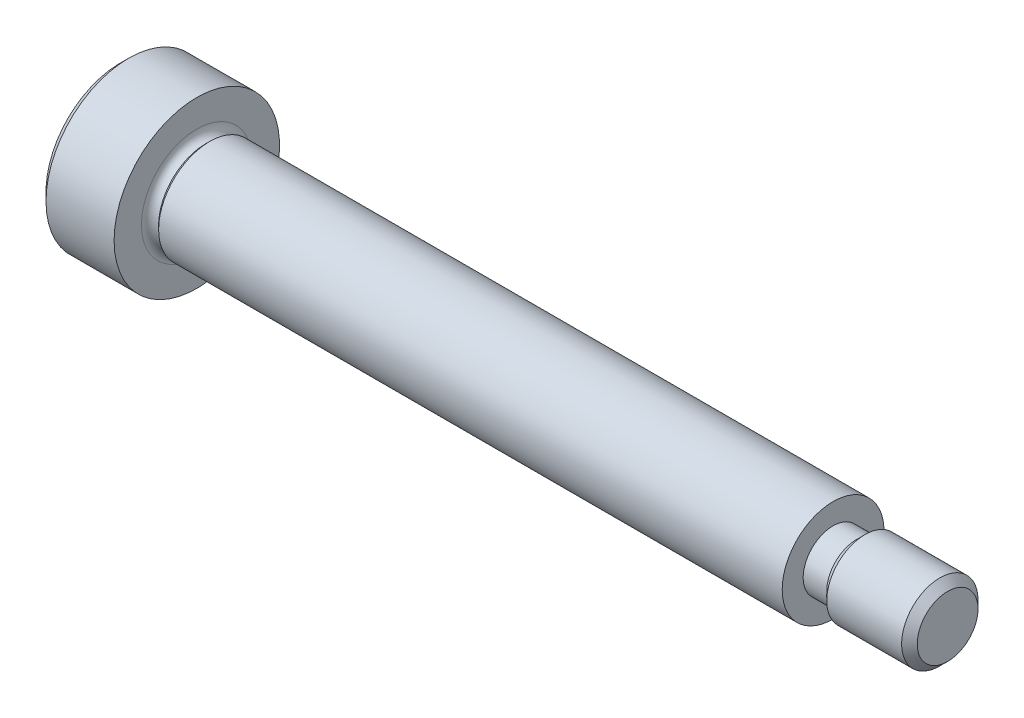
ISO-10303-21;
HEADER;
FILE_DESCRIPTION(('STEP AP214'),'2;1');
FILE_NAME('part.step','',(''),(''),'','','');
FILE_SCHEMA(('AUTOMOTIVE_DESIGN { 1 0 10303 214 1 1 1 1 }'));
ENDSEC;
DATA;
#1=APPLICATION_CONTEXT('core data for automotive mechanical design processes');
#2=APPLICATION_PROTOCOL_DEFINITION('international standard','automotive_design',2000,#1);
#3=PRODUCT_CONTEXT('',#1,'mechanical');
#4=PRODUCT('Part','Part','',(#3));
#5=PRODUCT_RELATED_PRODUCT_CATEGORY('part','',(#4));
#6=PRODUCT_DEFINITION_FORMATION('','',#4);
#7=PRODUCT_DEFINITION_CONTEXT('part definition',#1,'design');
#8=PRODUCT_DEFINITION('design','',#6,#7);
#9=PRODUCT_DEFINITION_SHAPE('','',#8);
#10=(LENGTH_UNIT() NAMED_UNIT(*) SI_UNIT(.MILLI.,.METRE.));
#11=(NAMED_UNIT(*) PLANE_ANGLE_UNIT() SI_UNIT($,.RADIAN.));
#12=(NAMED_UNIT(*) SI_UNIT($,.STERADIAN.) SOLID_ANGLE_UNIT());
#13=UNCERTAINTY_MEASURE_WITH_UNIT(LENGTH_MEASURE(1.E-05),#10,'distance_accuracy_value','');
#14=(GEOMETRIC_REPRESENTATION_CONTEXT(3) GLOBAL_UNCERTAINTY_ASSIGNED_CONTEXT((#13)) GLOBAL_UNIT_ASSIGNED_CONTEXT((#10,
#11,#12)) REPRESENTATION_CONTEXT('',''));
#15=CARTESIAN_POINT('',(0.,0.,0.));
#16=DIRECTION('',(0.,0.,1.));
#17=DIRECTION('',(1.,0.,0.));
#18=AXIS2_PLACEMENT_3D('',#15,#16,#17);
#19=CARTESIAN_POINT('',(-6.,-6.00984515230403,5.85));
#20=DIRECTION('',(-1.,0.,0.));
#21=DIRECTION('',(0.,1.,0.));
#22=AXIS2_PLACEMENT_3D('',#19,#20,#21);
#23=PLANE('',#22);
#24=CARTESIAN_POINT('',(-6.,0.,0.));
#25=DIRECTION('',(-1.,0.,0.));
#26=DIRECTION('',(0.,0.,-1.));
#27=AXIS2_PLACEMENT_3D('',#24,#25,#26);
#28=CIRCLE('',#27,5.85);
#29=CARTESIAN_POINT('',(-6.,0.,-5.85));
#30=VERTEX_POINT('',#29);
#31=EDGE_CURVE('E111',#30,#30,#28,.F.);
#32=ORIENTED_EDGE('',*,*,#31,.F.);
#33=EDGE_LOOP('',(#32));
#34=FACE_BOUND('',#33,.T.);
#35=DIRECTION('',(0.,0.499999999999983,-0.866025403784448));
#36=VECTOR('',#35,1.);
#37=CARTESIAN_POINT('',(-6.,-2.8867513459481,0.));
#38=LINE('',#37,#36);
#39=CARTESIAN_POINT('',(-6.,-1.4433756729741,-2.5));
#40=VERTEX_POINT('',#39);
#41=CARTESIAN_POINT('',(-6.,-2.8867513459481,0.));
#42=VERTEX_POINT('',#41);
#43=EDGE_CURVE('E98',#40,#42,#38,.F.);
#44=ORIENTED_EDGE('',*,*,#43,.F.);
#45=DIRECTION('',(0.,1.,0.));
#46=VECTOR('',#45,1.);
#47=CARTESIAN_POINT('',(-6.,-1.4433756729741,-2.5));
#48=LINE('',#47,#46);
#49=CARTESIAN_POINT('',(-6.,1.4433756729741,-2.5));
#50=VERTEX_POINT('',#49);
#51=EDGE_CURVE('E87',#50,#40,#48,.F.);
#52=ORIENTED_EDGE('',*,*,#51,.F.);
#53=DIRECTION('',(0.,0.499999999999983,0.866025403784449));
#54=VECTOR('',#53,1.);
#55=CARTESIAN_POINT('',(-6.,1.4433756729741,-2.5));
#56=LINE('',#55,#54);
#57=CARTESIAN_POINT('',(-6.,2.8867513459481,0.));
#58=VERTEX_POINT('',#57);
#59=EDGE_CURVE('E97',#58,#50,#56,.F.);
#60=ORIENTED_EDGE('',*,*,#59,.F.);
#61=DIRECTION('',(0.,-0.499999999999982,0.866025403784449));
#62=VECTOR('',#61,1.);
#63=CARTESIAN_POINT('',(-6.,2.8867513459481,0.));
#64=LINE('',#63,#62);
#65=CARTESIAN_POINT('',(-6.,1.4433756729741,2.5));
#66=VERTEX_POINT('',#65);
#67=EDGE_CURVE('E121',#66,#58,#64,.F.);
#68=ORIENTED_EDGE('',*,*,#67,.F.);
#69=DIRECTION('',(0.,-1.,0.));
#70=VECTOR('',#69,1.);
#71=CARTESIAN_POINT('',(-6.,1.4433756729741,2.5));
#72=LINE('',#71,#70);
#73=CARTESIAN_POINT('',(-6.,-1.4433756729741,2.5));
#74=VERTEX_POINT('',#73);
#75=EDGE_CURVE('E125',#74,#66,#72,.F.);
#76=ORIENTED_EDGE('',*,*,#75,.F.);
#77=DIRECTION('',(0.,-0.499999999999983,-0.866025403784448));
#78=VECTOR('',#77,1.);
#79=CARTESIAN_POINT('',(-6.,-1.4433756729741,2.5));
#80=LINE('',#79,#78);
#81=EDGE_CURVE('E110',#42,#74,#80,.F.);
#82=ORIENTED_EDGE('',*,*,#81,.F.);
#83=EDGE_LOOP('',(#44,#52,#60,#68,#76,#82));
#84=FACE_BOUND('',#83,.T.);
#85=ADVANCED_FACE('F17',(#34,#84),#23,.T.);
#86=CARTESIAN_POINT('',(0.,-6.67760572478225,-6.5));
#87=DIRECTION('',(1.,0.,0.));
#88=DIRECTION('',(0.,1.,0.));
#89=AXIS2_PLACEMENT_3D('',#86,#87,#88);
#90=PLANE('',#89);
#91=CARTESIAN_POINT('',(0.,0.,0.));
#92=DIRECTION('',(1.,0.,0.));
#93=DIRECTION('',(0.,0.,1.));
#94=AXIS2_PLACEMENT_3D('',#91,#92,#93);
#95=CIRCLE('',#94,6.5);
#96=CARTESIAN_POINT('',(0.,0.,6.5));
#97=VERTEX_POINT('',#96);
#98=EDGE_CURVE('E133',#97,#97,#95,.T.);
#99=ORIENTED_EDGE('',*,*,#98,.T.);
#100=EDGE_LOOP('',(#99));
#101=FACE_BOUND('',#100,.T.);
#102=CARTESIAN_POINT('',(0.,0.,0.));
#103=DIRECTION('',(-1.,0.,0.));
#104=DIRECTION('',(0.,0.,-1.));
#105=AXIS2_PLACEMENT_3D('',#102,#103,#104);
#106=CIRCLE('',#105,4.35000000000001);
#107=CARTESIAN_POINT('',(0.,0.,-4.35000000000001));
#108=VERTEX_POINT('',#107);
#109=EDGE_CURVE('E138',#108,#108,#106,.F.);
#110=ORIENTED_EDGE('',*,*,#109,.F.);
#111=EDGE_LOOP('',(#110));
#112=FACE_BOUND('',#111,.T.);
#113=ADVANCED_FACE('F284',(#101,#112),#90,.T.);
#114=CARTESIAN_POINT('',(50.,-4.,-4.));
#115=DIRECTION('',(1.,0.,0.));
#116=DIRECTION('',(0.,1.,0.));
#117=AXIS2_PLACEMENT_3D('',#114,#115,#116);
#118=PLANE('',#117);
#119=CARTESIAN_POINT('',(50.,0.,0.));
#120=DIRECTION('',(1.,0.,0.));
#121=DIRECTION('',(0.,0.,1.));
#122=AXIS2_PLACEMENT_3D('',#119,#120,#121);
#123=CIRCLE('',#122,4.);
#124=CARTESIAN_POINT('',(50.,0.,4.));
#125=VERTEX_POINT('',#124);
#126=EDGE_CURVE('E141',#125,#125,#123,.T.);
#127=ORIENTED_EDGE('',*,*,#126,.T.);
#128=EDGE_LOOP('',(#127));
#129=FACE_BOUND('',#128,.T.);
#130=CARTESIAN_POINT('',(50.,0.,0.));
#131=DIRECTION('',(-1.,0.,0.));
#132=DIRECTION('',(0.,0.,-1.));
#133=AXIS2_PLACEMENT_3D('',#130,#131,#132);
#134=CIRCLE('',#133,2.35);
#135=CARTESIAN_POINT('',(50.,0.,-2.35));
#136=VERTEX_POINT('',#135);
#137=EDGE_CURVE('E144',#136,#136,#134,.F.);
#138=ORIENTED_EDGE('',*,*,#137,.F.);
#139=EDGE_LOOP('',(#138));
#140=FACE_BOUND('',#139,.T.);
#141=ADVANCED_FACE('F281',(#129,#140),#118,.T.);
#142=CARTESIAN_POINT('',(59.,-2.3865,-2.3865));
#143=DIRECTION('',(1.,0.,0.));
#144=DIRECTION('',(0.,1.,0.));
#145=AXIS2_PLACEMENT_3D('',#142,#143,#144);
#146=PLANE('',#145);
#147=CARTESIAN_POINT('',(59.,0.,0.));
#148=DIRECTION('',(1.,0.,0.));
#149=DIRECTION('',(0.,0.,1.));
#150=AXIS2_PLACEMENT_3D('',#147,#148,#149);
#151=CIRCLE('',#150,2.3865);
#152=CARTESIAN_POINT('',(59.,0.,2.3865));
#153=VERTEX_POINT('',#152);
#154=EDGE_CURVE('E147',#153,#153,#151,.T.);
#155=ORIENTED_EDGE('',*,*,#154,.T.);
#156=EDGE_LOOP('',(#155));
#157=FACE_BOUND('',#156,.T.);
#158=ADVANCED_FACE('F283',(#157),#146,.T.);
#159=CARTESIAN_POINT('',(-3.,-2.16506350946112,-1.24999999999996));
#160=DIRECTION('',(-1.,0.,0.));
#161=DIRECTION('',(0.,1.,0.));
#162=AXIS2_PLACEMENT_3D('',#159,#160,#161);
#163=PLANE('',#162);
#164=DIRECTION('',(0.,-1.,0.));
#165=VECTOR('',#164,1.);
#166=CARTESIAN_POINT('',(-3.,0.,-2.5));
#167=LINE('',#166,#165);
#168=CARTESIAN_POINT('',(-3.,-1.4433756729741,-2.5));
#169=VERTEX_POINT('',#168);
#170=CARTESIAN_POINT('',(-3.,0.,-2.5));
#171=VERTEX_POINT('',#170);
#172=EDGE_CURVE('E150',#169,#171,#167,.F.);
#173=ORIENTED_EDGE('',*,*,#172,.F.);
#174=DIRECTION('',(0.,-0.499999999999983,0.866025403784448));
#175=VECTOR('',#174,1.);
#176=CARTESIAN_POINT('',(-3.,-1.4433756729741,-2.5));
#177=LINE('',#176,#175);
#178=CARTESIAN_POINT('',(-3.,-2.16506350946112,-1.24999999999996));
#179=VERTEX_POINT('',#178);
#180=EDGE_CURVE('E105',#179,#169,#177,.F.);
#181=ORIENTED_EDGE('',*,*,#180,.F.);
#182=CARTESIAN_POINT('',(-3.,0.,0.));
#183=DIRECTION('',(1.,0.,0.));
#184=DIRECTION('',(0.,-0.866025403784448,-0.499999999999983));
#185=AXIS2_PLACEMENT_3D('',#182,#183,#184);
#186=CIRCLE('',#185,2.5);
#187=EDGE_CURVE('E155',#179,#171,#186,.T.);
#188=ORIENTED_EDGE('',*,*,#187,.T.);
#189=EDGE_LOOP('',(#173,#181,#188));
#190=FACE_BOUND('',#189,.T.);
#191=ADVANCED_FACE('F292',(#190),#163,.T.);
#192=CARTESIAN_POINT('',(-3.,-2.8867513459481,1.24999999999996));
#193=DIRECTION('',(-1.,0.,0.));
#194=DIRECTION('',(0.,1.,0.));
#195=AXIS2_PLACEMENT_3D('',#192,#193,#194);
#196=PLANE('',#195);
#197=DIRECTION('',(0.,-0.499999999999983,0.866025403784448));
#198=VECTOR('',#197,1.);
#199=CARTESIAN_POINT('',(-3.,-2.16506350946112,-1.24999999999996));
#200=LINE('',#199,#198);
#201=CARTESIAN_POINT('',(-3.,-2.8867513459481,0.));
#202=VERTEX_POINT('',#201);
#203=EDGE_CURVE('E160',#202,#179,#200,.F.);
#204=ORIENTED_EDGE('',*,*,#203,.F.);
#205=DIRECTION('',(0.,0.499999999999983,0.866025403784448));
#206=VECTOR('',#205,1.);
#207=CARTESIAN_POINT('',(-3.,-2.8867513459481,0.));
#208=LINE('',#207,#206);
#209=CARTESIAN_POINT('',(-3.,-2.16506350946112,1.24999999999996));
#210=VERTEX_POINT('',#209);
#211=EDGE_CURVE('E164',#210,#202,#208,.F.);
#212=ORIENTED_EDGE('',*,*,#211,.F.);
#213=CARTESIAN_POINT('',(-3.,0.,0.));
#214=DIRECTION('',(1.,0.,0.));
#215=DIRECTION('',(0.,-0.866025403784448,0.499999999999983));
#216=AXIS2_PLACEMENT_3D('',#213,#214,#215);
#217=CIRCLE('',#216,2.5);
#218=EDGE_CURVE('E169',#210,#179,#217,.T.);
#219=ORIENTED_EDGE('',*,*,#218,.T.);
#220=EDGE_LOOP('',(#204,#212,#219));
#221=FACE_BOUND('',#220,.T.);
#222=ADVANCED_FACE('F355',(#221),#196,.T.);
#223=CARTESIAN_POINT('',(-3.,-2.16506350946112,2.5));
#224=DIRECTION('',(-1.,0.,0.));
#225=DIRECTION('',(0.,1.,0.));
#226=AXIS2_PLACEMENT_3D('',#223,#224,#225);
#227=PLANE('',#226);
#228=DIRECTION('',(0.,0.499999999999983,0.866025403784448));
#229=VECTOR('',#228,1.);
#230=CARTESIAN_POINT('',(-3.,-2.16506350946112,1.24999999999996));
#231=LINE('',#230,#229);
#232=CARTESIAN_POINT('',(-3.,-1.4433756729741,2.5));
#233=VERTEX_POINT('',#232);
#234=EDGE_CURVE('E174',#233,#210,#231,.F.);
#235=ORIENTED_EDGE('',*,*,#234,.F.);
#236=DIRECTION('',(0.,1.,0.));
#237=VECTOR('',#236,1.);
#238=CARTESIAN_POINT('',(-3.,-1.4433756729741,2.5));
#239=LINE('',#238,#237);
#240=CARTESIAN_POINT('',(-3.,0.,2.5));
#241=VERTEX_POINT('',#240);
#242=EDGE_CURVE('E178',#241,#233,#239,.F.);
#243=ORIENTED_EDGE('',*,*,#242,.F.);
#244=CARTESIAN_POINT('',(-3.,0.,0.));
#245=DIRECTION('',(1.,0.,0.));
#246=DIRECTION('',(0.,0.,1.));
#247=AXIS2_PLACEMENT_3D('',#244,#245,#246);
#248=CIRCLE('',#247,2.5);
#249=EDGE_CURVE('E183',#241,#210,#248,.T.);
#250=ORIENTED_EDGE('',*,*,#249,.T.);
#251=EDGE_LOOP('',(#235,#243,#250));
#252=FACE_BOUND('',#251,.T.);
#253=ADVANCED_FACE('F361',(#252),#227,.T.);
#254=CARTESIAN_POINT('',(-3.,0.,2.5));
#255=DIRECTION('',(-1.,0.,0.));
#256=DIRECTION('',(0.,1.,0.));
#257=AXIS2_PLACEMENT_3D('',#254,#255,#256);
#258=PLANE('',#257);
#259=DIRECTION('',(0.,1.,0.));
#260=VECTOR('',#259,1.);
#261=CARTESIAN_POINT('',(-3.,0.,2.5));
#262=LINE('',#261,#260);
#263=CARTESIAN_POINT('',(-3.,1.4433756729741,2.5));
#264=VERTEX_POINT('',#263);
#265=EDGE_CURVE('E188',#264,#241,#262,.F.);
#266=ORIENTED_EDGE('',*,*,#265,.F.);
#267=DIRECTION('',(0.,0.499999999999982,-0.866025403784449));
#268=VECTOR('',#267,1.);
#269=CARTESIAN_POINT('',(-3.,1.4433756729741,2.5));
#270=LINE('',#269,#268);
#271=CARTESIAN_POINT('',(-3.,2.16506350946112,1.24999999999996));
#272=VERTEX_POINT('',#271);
#273=EDGE_CURVE('E192',#272,#264,#270,.F.);
#274=ORIENTED_EDGE('',*,*,#273,.F.);
#275=CARTESIAN_POINT('',(-3.,0.,0.));
#276=DIRECTION('',(1.,0.,0.));
#277=DIRECTION('',(0.,0.866025403784448,0.499999999999983));
#278=AXIS2_PLACEMENT_3D('',#275,#276,#277);
#279=CIRCLE('',#278,2.5);
#280=EDGE_CURVE('E196',#272,#241,#279,.T.);
#281=ORIENTED_EDGE('',*,*,#280,.T.);
#282=EDGE_LOOP('',(#266,#274,#281));
#283=FACE_BOUND('',#282,.T.);
#284=ADVANCED_FACE('F368',(#283),#258,.T.);
#285=CARTESIAN_POINT('',(-3.,2.16506350946112,1.24999999999996));
#286=DIRECTION('',(-1.,0.,0.));
#287=DIRECTION('',(0.,1.,0.));
#288=AXIS2_PLACEMENT_3D('',#285,#286,#287);
#289=PLANE('',#288);
#290=DIRECTION('',(0.,0.499999999999985,-0.866025403784448));
#291=VECTOR('',#290,1.);
#292=CARTESIAN_POINT('',(-3.,2.16506350946112,1.24999999999996));
#293=LINE('',#292,#291);
#294=CARTESIAN_POINT('',(-3.,2.8867513459481,0.));
#295=VERTEX_POINT('',#294);
#296=EDGE_CURVE('E201',#295,#272,#293,.F.);
#297=ORIENTED_EDGE('',*,*,#296,.F.);
#298=DIRECTION('',(0.,-0.499999999999984,-0.866025403784448));
#299=VECTOR('',#298,1.);
#300=CARTESIAN_POINT('',(-3.,2.8867513459481,0.));
#301=LINE('',#300,#299);
#302=CARTESIAN_POINT('',(-3.,2.16506350946112,-1.24999999999996));
#303=VERTEX_POINT('',#302);
#304=EDGE_CURVE('E205',#303,#295,#301,.F.);
#305=ORIENTED_EDGE('',*,*,#304,.F.);
#306=CARTESIAN_POINT('',(-3.,0.,0.));
#307=DIRECTION('',(1.,0.,0.));
#308=DIRECTION('',(0.,0.866025403784448,-0.499999999999983));
#309=AXIS2_PLACEMENT_3D('',#306,#307,#308);
#310=CIRCLE('',#309,2.5);
#311=EDGE_CURVE('E210',#303,#272,#310,.T.);
#312=ORIENTED_EDGE('',*,*,#311,.T.);
#313=EDGE_LOOP('',(#297,#305,#312));
#314=FACE_BOUND('',#313,.T.);
#315=ADVANCED_FACE('F373',(#314),#289,.T.);
#316=CARTESIAN_POINT('',(-3.,0.,-1.24999999999996));
#317=DIRECTION('',(-1.,0.,0.));
#318=DIRECTION('',(0.,1.,0.));
#319=AXIS2_PLACEMENT_3D('',#316,#317,#318);
#320=PLANE('',#319);
#321=DIRECTION('',(0.,-0.499999999999983,-0.866025403784449));
#322=VECTOR('',#321,1.);
#323=CARTESIAN_POINT('',(-3.,2.16506350946112,-1.24999999999996));
#324=LINE('',#323,#322);
#325=CARTESIAN_POINT('',(-3.,1.4433756729741,-2.5));
#326=VERTEX_POINT('',#325);
#327=EDGE_CURVE('E215',#326,#303,#324,.F.);
#328=ORIENTED_EDGE('',*,*,#327,.F.);
#329=DIRECTION('',(0.,-1.,0.));
#330=VECTOR('',#329,1.);
#331=CARTESIAN_POINT('',(-3.,1.4433756729741,-2.5));
#332=LINE('',#331,#330);
#333=EDGE_CURVE('E219',#171,#326,#332,.F.);
#334=ORIENTED_EDGE('',*,*,#333,.F.);
#335=CARTESIAN_POINT('',(-3.,0.,0.));
#336=DIRECTION('',(1.,0.,0.));
#337=DIRECTION('',(0.,0.,-1.));
#338=AXIS2_PLACEMENT_3D('',#335,#336,#337);
#339=CIRCLE('',#338,2.5);
#340=EDGE_CURVE('E223',#171,#303,#339,.T.);
#341=ORIENTED_EDGE('',*,*,#340,.T.);
#342=EDGE_LOOP('',(#328,#334,#341));
#343=FACE_BOUND('',#342,.T.);
#344=ADVANCED_FACE('F376',(#343),#320,.T.);
#345=CARTESIAN_POINT('',(-3.,-1.4433756729741,2.5));
#346=DIRECTION('',(0.,0.,-1.));
#347=DIRECTION('',(-1.,0.,0.));
#348=AXIS2_PLACEMENT_3D('',#345,#346,#347);
#349=PLANE('',#348);
#350=ORIENTED_EDGE('',*,*,#265,.T.);
#351=ORIENTED_EDGE('',*,*,#242,.T.);
#352=DIRECTION('',(-1.,0.,0.));
#353=VECTOR('',#352,1.);
#354=CARTESIAN_POINT('',(-3.,-1.4433756729741,2.5));
#355=LINE('',#354,#353);
#356=EDGE_CURVE('E228',#233,#74,#355,.T.);
#357=ORIENTED_EDGE('',*,*,#356,.T.);
#358=ORIENTED_EDGE('',*,*,#75,.T.);
#359=DIRECTION('',(1.,0.,0.));
#360=VECTOR('',#359,1.);
#361=CARTESIAN_POINT('',(-6.,1.4433756729741,2.5));
#362=LINE('',#361,#360);
#363=EDGE_CURVE('E233',#264,#66,#362,.F.);
#364=ORIENTED_EDGE('',*,*,#363,.F.);
#365=EDGE_LOOP('',(#350,#351,#357,#358,#364));
#366=FACE_BOUND('',#365,.T.);
#367=ADVANCED_FACE('F363',(#366),#349,.T.);
#368=CARTESIAN_POINT('',(-6.,-2.8867513459481,0.));
#369=DIRECTION('',(0.,0.866025403784449,-0.499999999999983));
#370=DIRECTION('',(0.,0.499999999999983,0.866025403784449));
#371=AXIS2_PLACEMENT_3D('',#368,#369,#370);
#372=PLANE('',#371);
#373=ORIENTED_EDGE('',*,*,#234,.T.);
#374=ORIENTED_EDGE('',*,*,#211,.T.);
#375=DIRECTION('',(-1.,0.,0.));
#376=VECTOR('',#375,1.);
#377=CARTESIAN_POINT('',(-3.,-2.8867513459481,0.));
#378=LINE('',#377,#376);
#379=EDGE_CURVE('E106',#202,#42,#378,.T.);
#380=ORIENTED_EDGE('',*,*,#379,.T.);
#381=ORIENTED_EDGE('',*,*,#81,.T.);
#382=ORIENTED_EDGE('',*,*,#356,.F.);
#383=EDGE_LOOP('',(#373,#374,#380,#381,#382));
#384=FACE_BOUND('',#383,.T.);
#385=ADVANCED_FACE('F357',(#384),#372,.T.);
#386=CARTESIAN_POINT('',(-6.,-1.4433756729741,-2.5));
#387=DIRECTION('',(0.,0.866025403784449,0.499999999999983));
#388=DIRECTION('',(0.,-0.499999999999983,0.866025403784449));
#389=AXIS2_PLACEMENT_3D('',#386,#387,#388);
#390=PLANE('',#389);
#391=ORIENTED_EDGE('',*,*,#203,.T.);
#392=ORIENTED_EDGE('',*,*,#180,.T.);
#393=DIRECTION('',(-1.,0.,0.));
#394=VECTOR('',#393,1.);
#395=CARTESIAN_POINT('',(-3.,-1.4433756729741,-2.5));
#396=LINE('',#395,#394);
#397=EDGE_CURVE('E91',#169,#40,#396,.T.);
#398=ORIENTED_EDGE('',*,*,#397,.T.);
#399=ORIENTED_EDGE('',*,*,#43,.T.);
#400=ORIENTED_EDGE('',*,*,#379,.F.);
#401=EDGE_LOOP('',(#391,#392,#398,#399,#400));
#402=FACE_BOUND('',#401,.T.);
#403=ADVANCED_FACE('F102',(#402),#390,.T.);
#404=CARTESIAN_POINT('',(-6.,-1.4433756729741,-2.5));
#405=DIRECTION('',(0.,0.,1.));
#406=DIRECTION('',(1.,0.,0.));
#407=AXIS2_PLACEMENT_3D('',#404,#405,#406);
#408=PLANE('',#407);
#409=ORIENTED_EDGE('',*,*,#172,.T.);
#410=ORIENTED_EDGE('',*,*,#333,.T.);
#411=DIRECTION('',(-1.,0.,0.));
#412=VECTOR('',#411,1.);
#413=CARTESIAN_POINT('',(-3.,1.4433756729741,-2.5));
#414=LINE('',#413,#412);
#415=EDGE_CURVE('E35',#326,#50,#414,.T.);
#416=ORIENTED_EDGE('',*,*,#415,.T.);
#417=ORIENTED_EDGE('',*,*,#51,.T.);
#418=ORIENTED_EDGE('',*,*,#397,.F.);
#419=EDGE_LOOP('',(#409,#410,#416,#417,#418));
#420=FACE_BOUND('',#419,.T.);
#421=ADVANCED_FACE('F90',(#420),#408,.T.);
#422=CARTESIAN_POINT('',(-6.,2.8867513459481,0.));
#423=DIRECTION('',(0.,-0.866025403784449,0.499999999999983));
#424=DIRECTION('',(0.,-0.499999999999983,-0.866025403784449));
#425=AXIS2_PLACEMENT_3D('',#422,#423,#424);
#426=PLANE('',#425);
#427=ORIENTED_EDGE('',*,*,#327,.T.);
#428=ORIENTED_EDGE('',*,*,#304,.T.);
#429=DIRECTION('',(-1.,0.,0.));
#430=VECTOR('',#429,1.);
#431=CARTESIAN_POINT('',(-3.,2.8867513459481,0.));
#432=LINE('',#431,#430);
#433=EDGE_CURVE('E245',#295,#58,#432,.T.);
#434=ORIENTED_EDGE('',*,*,#433,.T.);
#435=ORIENTED_EDGE('',*,*,#59,.T.);
#436=ORIENTED_EDGE('',*,*,#415,.F.);
#437=EDGE_LOOP('',(#427,#428,#434,#435,#436));
#438=FACE_BOUND('',#437,.T.);
#439=ADVANCED_FACE('F317',(#438),#426,.T.);
#440=CARTESIAN_POINT('',(-6.,1.4433756729741,2.5));
#441=DIRECTION('',(0.,-0.866025403784449,-0.499999999999983));
#442=DIRECTION('',(0.,0.499999999999983,-0.866025403784449));
#443=AXIS2_PLACEMENT_3D('',#440,#441,#442);
#444=PLANE('',#443);
#445=ORIENTED_EDGE('',*,*,#296,.T.);
#446=ORIENTED_EDGE('',*,*,#273,.T.);
#447=ORIENTED_EDGE('',*,*,#363,.T.);
#448=ORIENTED_EDGE('',*,*,#67,.T.);
#449=ORIENTED_EDGE('',*,*,#433,.F.);
#450=EDGE_LOOP('',(#445,#446,#447,#448,#449));
#451=FACE_BOUND('',#450,.T.);
#452=ADVANCED_FACE('F307',(#451),#444,.T.);
#453=CARTESIAN_POINT('',(-5.35,0.,0.));
#454=DIRECTION('',(1.,0.,0.));
#455=DIRECTION('',(0.,0.,1.));
#456=AXIS2_PLACEMENT_3D('',#453,#454,#455);
#457=CONICAL_SURFACE('',#456,6.5,0.78539816339745);
#458=CARTESIAN_POINT('',(-5.35,0.,0.));
#459=DIRECTION('',(-1.,0.,0.));
#460=DIRECTION('',(0.,0.,-1.));
#461=AXIS2_PLACEMENT_3D('',#458,#459,#460);
#462=CIRCLE('',#461,6.5);
#463=CARTESIAN_POINT('',(-5.35,0.,-6.5));
#464=VERTEX_POINT('',#463);
#465=EDGE_CURVE('E250',#464,#464,#462,.F.);
#466=ORIENTED_EDGE('',*,*,#465,.F.);
#467=EDGE_LOOP('',(#466));
#468=FACE_BOUND('',#467,.T.);
#469=ORIENTED_EDGE('',*,*,#31,.T.);
#470=EDGE_LOOP('',(#469));
#471=FACE_BOUND('',#470,.T.);
#472=ADVANCED_FACE('F304',(#468,#471),#457,.T.);
#473=CARTESIAN_POINT('',(59.,0.,0.));
#474=DIRECTION('',(1.,0.,0.));
#475=DIRECTION('',(0.,0.,1.));
#476=AXIS2_PLACEMENT_3D('',#473,#474,#475);
#477=CYLINDRICAL_SURFACE('',#476,6.5);
#478=ORIENTED_EDGE('',*,*,#98,.F.);
#479=EDGE_LOOP('',(#478));
#480=FACE_BOUND('',#479,.T.);
#481=ORIENTED_EDGE('',*,*,#465,.T.);
#482=EDGE_LOOP('',(#481));
#483=FACE_BOUND('',#482,.T.);
#484=ADVANCED_FACE('F306',(#480,#483),#477,.T.);
#485=CARTESIAN_POINT('',(0.630586880057231,0.,0.));
#486=DIRECTION('',(1.,0.,0.));
#487=DIRECTION('',(0.,1.92332938804693E-10,1.));
#488=AXIS2_PLACEMENT_3D('',#485,#486,#487);
#489=TOROIDAL_SURFACE('',#488,4.32717048621548,0.630999999999961);
#490=CARTESIAN_POINT('',(0.700000000000001,0.,0.));
#491=DIRECTION('',(-1.,0.,0.));
#492=DIRECTION('',(0.,0.,-1.));
#493=AXIS2_PLACEMENT_3D('',#490,#491,#492);
#494=CIRCLE('',#493,3.7);
#495=CARTESIAN_POINT('',(0.700000000000001,0.,-3.7));
#496=VERTEX_POINT('',#495);
#497=EDGE_CURVE('E255',#496,#496,#494,.F.);
#498=ORIENTED_EDGE('',*,*,#497,.F.);
#499=EDGE_LOOP('',(#498));
#500=FACE_BOUND('',#499,.T.);
#501=ORIENTED_EDGE('',*,*,#109,.T.);
#502=EDGE_LOOP('',(#501));
#503=FACE_BOUND('',#502,.T.);
#504=ADVANCED_FACE('F314',(#500,#503),#489,.F.);
#505=CARTESIAN_POINT('',(1.,0.,0.));
#506=DIRECTION('',(1.,0.,0.));
#507=DIRECTION('',(0.,1.92332938804693E-10,1.));
#508=AXIS2_PLACEMENT_3D('',#505,#506,#507);
#509=CONICAL_SURFACE('',#508,4.,0.785398163397447);
#510=CARTESIAN_POINT('',(1.,0.,0.));
#511=DIRECTION('',(-1.,0.,0.));
#512=DIRECTION('',(0.,0.,-1.));
#513=AXIS2_PLACEMENT_3D('',#510,#511,#512);
#514=CIRCLE('',#513,4.);
#515=CARTESIAN_POINT('',(1.,0.,-4.));
#516=VERTEX_POINT('',#515);
#517=EDGE_CURVE('E258',#516,#516,#514,.F.);
#518=ORIENTED_EDGE('',*,*,#517,.F.);
#519=EDGE_LOOP('',(#518));
#520=FACE_BOUND('',#519,.T.);
#521=ORIENTED_EDGE('',*,*,#497,.T.);
#522=EDGE_LOOP('',(#521));
#523=FACE_BOUND('',#522,.T.);
#524=ADVANCED_FACE('F325',(#520,#523),#509,.T.);
#525=CARTESIAN_POINT('',(59.,0.,0.));
#526=DIRECTION('',(1.,0.,0.));
#527=DIRECTION('',(0.,7.69313624256337E-10,1.));
#528=AXIS2_PLACEMENT_3D('',#525,#526,#527);
#529=CYLINDRICAL_SURFACE('',#528,4.);
#530=ORIENTED_EDGE('',*,*,#126,.F.);
#531=EDGE_LOOP('',(#530));
#532=FACE_BOUND('',#531,.T.);
#533=ORIENTED_EDGE('',*,*,#517,.T.);
#534=EDGE_LOOP('',(#533));
#535=FACE_BOUND('',#534,.T.);
#536=ADVANCED_FACE('F277',(#532,#535),#529,.T.);
#537=CARTESIAN_POINT('',(59.,0.,0.));
#538=DIRECTION('',(1.,0.,0.));
#539=DIRECTION('',(0.,1.92347149659408E-10,1.));
#540=AXIS2_PLACEMENT_3D('',#537,#538,#539);
#541=CYLINDRICAL_SURFACE('',#540,2.35);
#542=CARTESIAN_POINT('',(51.85,0.,0.));
#543=DIRECTION('',(-1.,0.,0.));
#544=DIRECTION('',(0.,0.,-1.));
#545=AXIS2_PLACEMENT_3D('',#542,#543,#544);
#546=CIRCLE('',#545,2.35);
#547=CARTESIAN_POINT('',(51.85,0.,-2.35));
#548=VERTEX_POINT('',#547);
#549=EDGE_CURVE('E261',#548,#548,#546,.F.);
#550=ORIENTED_EDGE('',*,*,#549,.F.);
#551=EDGE_LOOP('',(#550));
#552=FACE_BOUND('',#551,.T.);
#553=ORIENTED_EDGE('',*,*,#137,.T.);
#554=EDGE_LOOP('',(#553));
#555=FACE_BOUND('',#554,.T.);
#556=ADVANCED_FACE('F271',(#552,#555),#541,.T.);
#557=CARTESIAN_POINT('',(52.5,0.,0.));
#558=DIRECTION('',(1.,0.,0.));
#559=DIRECTION('',(0.,7.69387343065172E-10,1.));
#560=AXIS2_PLACEMENT_3D('',#557,#558,#559);
#561=CONICAL_SURFACE('',#560,3.,0.78539816339745);
#562=CARTESIAN_POINT('',(52.5,0.,0.));
#563=DIRECTION('',(-1.,0.,0.));
#564=DIRECTION('',(0.,0.,-1.));
#565=AXIS2_PLACEMENT_3D('',#562,#563,#564);
#566=CIRCLE('',#565,3.);
#567=CARTESIAN_POINT('',(52.5,0.,-3.));
#568=VERTEX_POINT('',#567);
#569=EDGE_CURVE('E25',#568,#568,#566,.F.);
#570=ORIENTED_EDGE('',*,*,#569,.F.);
#571=EDGE_LOOP('',(#570));
#572=FACE_BOUND('',#571,.T.);
#573=ORIENTED_EDGE('',*,*,#549,.T.);
#574=EDGE_LOOP('',(#573));
#575=FACE_BOUND('',#574,.T.);
#576=ADVANCED_FACE('F268',(#572,#575),#561,.T.);
#577=CARTESIAN_POINT('',(59.,0.,0.));
#578=DIRECTION('',(1.,0.,0.));
#579=DIRECTION('',(0.,0.,1.));
#580=AXIS2_PLACEMENT_3D('',#577,#578,#579);
#581=CYLINDRICAL_SURFACE('',#580,3.);
#582=CARTESIAN_POINT('',(58.3865,0.,0.));
#583=DIRECTION('',(-1.,0.,0.));
#584=DIRECTION('',(0.,0.,-1.));
#585=AXIS2_PLACEMENT_3D('',#582,#583,#584);
#586=CIRCLE('',#585,3.);
#587=CARTESIAN_POINT('',(58.3865,0.,-3.));
#588=VERTEX_POINT('',#587);
#589=EDGE_CURVE('E11',#588,#588,#586,.F.);
#590=ORIENTED_EDGE('',*,*,#589,.F.);
#591=EDGE_LOOP('',(#590));
#592=FACE_BOUND('',#591,.T.);
#593=ORIENTED_EDGE('',*,*,#569,.T.);
#594=EDGE_LOOP('',(#593));
#595=FACE_BOUND('',#594,.T.);
#596=ADVANCED_FACE('F266',(#592,#595),#581,.T.);
#597=CARTESIAN_POINT('',(58.3865,0.,0.));
#598=DIRECTION('',(-1.,0.,0.));
#599=DIRECTION('',(0.,0.,-1.));
#600=AXIS2_PLACEMENT_3D('',#597,#598,#599);
#601=CONICAL_SURFACE('',#600,3.,0.785398163397446);
#602=ORIENTED_EDGE('',*,*,#154,.F.);
#603=EDGE_LOOP('',(#602));
#604=FACE_BOUND('',#603,.T.);
#605=ORIENTED_EDGE('',*,*,#589,.T.);
#606=EDGE_LOOP('',(#605));
#607=FACE_BOUND('',#606,.T.);
#608=ADVANCED_FACE('F334',(#604,#607),#601,.T.);
#609=CARTESIAN_POINT('',(-3.,0.,0.));
#610=DIRECTION('',(-1.,0.,0.));
#611=DIRECTION('',(0.,0.,-1.));
#612=AXIS2_PLACEMENT_3D('',#609,#610,#611);
#613=CONICAL_SURFACE('',#612,2.5,1.04719755119659);
#614=ORIENTED_EDGE('',*,*,#187,.F.);
#615=ORIENTED_EDGE('',*,*,#218,.F.);
#616=ORIENTED_EDGE('',*,*,#249,.F.);
#617=ORIENTED_EDGE('',*,*,#280,.F.);
#618=ORIENTED_EDGE('',*,*,#311,.F.);
#619=ORIENTED_EDGE('',*,*,#340,.F.);
#620=EDGE_LOOP('',(#614,#615,#616,#617,#618,#619));
#621=FACE_BOUND('',#620,.T.);
#622=CARTESIAN_POINT('',(-1.5566243270259,0.,0.));
#623=VERTEX_POINT('',#622);
#624=VERTEX_LOOP('',#623);
#625=FACE_BOUND('',#624,.T.);
#626=ADVANCED_FACE('F19',(#621,#625),#613,.F.);
#627=CLOSED_SHELL('',(#85,#113,#141,#158,#191,#222,#253,#284,#315,#344,#367,#385,#403,#421,#439,
#452,#472,#484,#504,#524,#536,#556,#576,#596,#608,#626));
#628=MANIFOLD_SOLID_BREP('B1',#627);
#629=ADVANCED_BREP_SHAPE_REPRESENTATION('',(#18,#628),#14);
#630=SHAPE_DEFINITION_REPRESENTATION(#9,#629);
ENDSEC;
END-ISO-10303-21;
